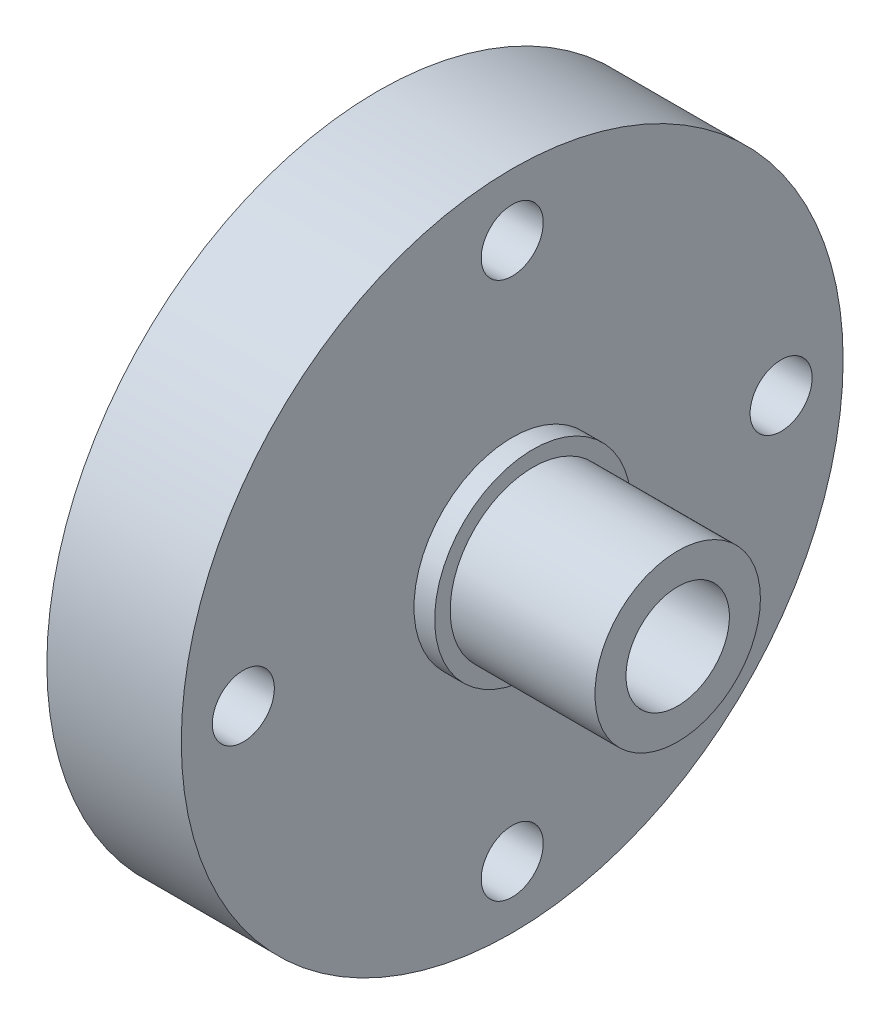
ISO-10303-21;
HEADER;
FILE_DESCRIPTION(('STEP AP214'),'2;1');
FILE_NAME('part.step','',(''),(''),'','','');
FILE_SCHEMA(('AUTOMOTIVE_DESIGN { 1 0 10303 214 1 1 1 1 }'));
ENDSEC;
DATA;
#1=APPLICATION_CONTEXT('core data for automotive mechanical design processes');
#2=APPLICATION_PROTOCOL_DEFINITION('international standard','automotive_design',2000,#1);
#3=PRODUCT_CONTEXT('',#1,'mechanical');
#4=PRODUCT('Part','Part','',(#3));
#5=PRODUCT_RELATED_PRODUCT_CATEGORY('part','',(#4));
#6=PRODUCT_DEFINITION_FORMATION('','',#4);
#7=PRODUCT_DEFINITION_CONTEXT('part definition',#1,'design');
#8=PRODUCT_DEFINITION('design','',#6,#7);
#9=PRODUCT_DEFINITION_SHAPE('','',#8);
#10=(LENGTH_UNIT() NAMED_UNIT(*) SI_UNIT(.MILLI.,.METRE.));
#11=(NAMED_UNIT(*) PLANE_ANGLE_UNIT() SI_UNIT($,.RADIAN.));
#12=(NAMED_UNIT(*) SI_UNIT($,.STERADIAN.) SOLID_ANGLE_UNIT());
#13=UNCERTAINTY_MEASURE_WITH_UNIT(LENGTH_MEASURE(1.E-05),#10,'distance_accuracy_value','');
#14=(GEOMETRIC_REPRESENTATION_CONTEXT(3) GLOBAL_UNCERTAINTY_ASSIGNED_CONTEXT((#13)) GLOBAL_UNIT_ASSIGNED_CONTEXT((#10,
#11,#12)) REPRESENTATION_CONTEXT('',''));
#15=CARTESIAN_POINT('',(0.,0.,0.));
#16=DIRECTION('',(0.,0.,1.));
#17=DIRECTION('',(1.,0.,0.));
#18=AXIS2_PLACEMENT_3D('',#15,#16,#17);
#19=CARTESIAN_POINT('',(6.5,0.,0.));
#20=DIRECTION('',(1.,0.,0.));
#21=DIRECTION('',(0.,0.,-1.));
#22=AXIS2_PLACEMENT_3D('',#19,#20,#21);
#23=PLANE('',#22);
#24=CARTESIAN_POINT('',(6.5,0.,0.));
#25=DIRECTION('',(1.,0.,0.));
#26=DIRECTION('',(0.,0.,-1.));
#27=AXIS2_PLACEMENT_3D('',#24,#25,#26);
#28=CIRCLE('',#27,16.);
#29=CARTESIAN_POINT('',(6.5,0.,16.));
#30=VERTEX_POINT('',#29);
#31=EDGE_CURVE('E51',#30,#30,#28,.T.);
#32=ORIENTED_EDGE('',*,*,#31,.T.);
#33=EDGE_LOOP('',(#32));
#34=FACE_BOUND('',#33,.T.);
#35=CARTESIAN_POINT('',(6.5,1.36167772214882E-13,13.));
#36=DIRECTION('',(1.,0.,0.));
#37=DIRECTION('',(0.,0.,-1.));
#38=AXIS2_PLACEMENT_3D('',#35,#36,#37);
#39=CIRCLE('',#38,1.5);
#40=CARTESIAN_POINT('',(6.5,1.36167772214882E-13,11.5));
#41=VERTEX_POINT('',#40);
#42=EDGE_CURVE('E86',#41,#41,#39,.T.);
#43=ORIENTED_EDGE('',*,*,#42,.F.);
#44=EDGE_LOOP('',(#43));
#45=FACE_BOUND('',#44,.T.);
#46=CARTESIAN_POINT('',(6.5,-13.,0.));
#47=DIRECTION('',(1.,0.,0.));
#48=DIRECTION('',(0.,0.,-1.));
#49=AXIS2_PLACEMENT_3D('',#46,#47,#48);
#50=CIRCLE('',#49,1.5);
#51=CARTESIAN_POINT('',(6.5,-13.,-1.49999999999991));
#52=VERTEX_POINT('',#51);
#53=EDGE_CURVE('E80',#52,#52,#50,.T.);
#54=ORIENTED_EDGE('',*,*,#53,.F.);
#55=EDGE_LOOP('',(#54));
#56=FACE_BOUND('',#55,.T.);
#57=CARTESIAN_POINT('',(6.5,0.,-13.));
#58=DIRECTION('',(1.,0.,0.));
#59=DIRECTION('',(0.,0.,-1.));
#60=AXIS2_PLACEMENT_3D('',#57,#58,#59);
#61=CIRCLE('',#60,1.5);
#62=CARTESIAN_POINT('',(6.5,0.,-14.5));
#63=VERTEX_POINT('',#62);
#64=EDGE_CURVE('E74',#63,#63,#61,.T.);
#65=ORIENTED_EDGE('',*,*,#64,.F.);
#66=EDGE_LOOP('',(#65));
#67=FACE_BOUND('',#66,.T.);
#68=CARTESIAN_POINT('',(6.5,13.,0.));
#69=DIRECTION('',(1.,0.,0.));
#70=DIRECTION('',(0.,0.,-1.));
#71=AXIS2_PLACEMENT_3D('',#68,#69,#70);
#72=CIRCLE('',#71,1.5);
#73=CARTESIAN_POINT('',(6.5,13.,-1.5));
#74=VERTEX_POINT('',#73);
#75=EDGE_CURVE('E71',#74,#74,#72,.T.);
#76=ORIENTED_EDGE('',*,*,#75,.F.);
#77=EDGE_LOOP('',(#76));
#78=FACE_BOUND('',#77,.T.);
#79=CARTESIAN_POINT('',(6.5,0.,0.));
#80=DIRECTION('',(1.,0.,0.));
#81=DIRECTION('',(0.,0.,-1.));
#82=AXIS2_PLACEMENT_3D('',#79,#80,#81);
#83=CIRCLE('',#82,4.75);
#84=CARTESIAN_POINT('',(6.5,0.,-4.75));
#85=VERTEX_POINT('',#84);
#86=EDGE_CURVE('E64',#85,#85,#83,.T.);
#87=ORIENTED_EDGE('',*,*,#86,.F.);
#88=EDGE_LOOP('',(#87));
#89=FACE_BOUND('',#88,.T.);
#90=ADVANCED_FACE('F43',(#34,#45,#56,#67,#78,#89),#23,.T.);
#91=CARTESIAN_POINT('',(0.,0.,0.));
#92=DIRECTION('',(1.,0.,0.));
#93=DIRECTION('',(0.,0.,-1.));
#94=AXIS2_PLACEMENT_3D('',#91,#92,#93);
#95=PLANE('',#94);
#96=CARTESIAN_POINT('',(0.,13.,0.));
#97=DIRECTION('',(1.,0.,0.));
#98=DIRECTION('',(0.,0.,-1.));
#99=AXIS2_PLACEMENT_3D('',#96,#97,#98);
#100=CIRCLE('',#99,1.5);
#101=CARTESIAN_POINT('',(0.,13.,-1.5));
#102=VERTEX_POINT('',#101);
#103=EDGE_CURVE('E67',#102,#102,#100,.T.);
#104=ORIENTED_EDGE('',*,*,#103,.T.);
#105=EDGE_LOOP('',(#104));
#106=FACE_BOUND('',#105,.T.);
#107=CARTESIAN_POINT('',(0.,0.,-13.));
#108=DIRECTION('',(1.,0.,0.));
#109=DIRECTION('',(0.,0.,-1.));
#110=AXIS2_PLACEMENT_3D('',#107,#108,#109);
#111=CIRCLE('',#110,1.5);
#112=CARTESIAN_POINT('',(0.,0.,-14.5));
#113=VERTEX_POINT('',#112);
#114=EDGE_CURVE('E77',#113,#113,#111,.T.);
#115=ORIENTED_EDGE('',*,*,#114,.T.);
#116=EDGE_LOOP('',(#115));
#117=FACE_BOUND('',#116,.T.);
#118=CARTESIAN_POINT('',(0.,-13.,0.));
#119=DIRECTION('',(1.,0.,0.));
#120=DIRECTION('',(0.,0.,-1.));
#121=AXIS2_PLACEMENT_3D('',#118,#119,#120);
#122=CIRCLE('',#121,1.5);
#123=CARTESIAN_POINT('',(0.,-13.,-1.49999999999991));
#124=VERTEX_POINT('',#123);
#125=EDGE_CURVE('E83',#124,#124,#122,.T.);
#126=ORIENTED_EDGE('',*,*,#125,.T.);
#127=EDGE_LOOP('',(#126));
#128=FACE_BOUND('',#127,.T.);
#129=CARTESIAN_POINT('',(0.,1.36167772214882E-13,13.));
#130=DIRECTION('',(1.,0.,0.));
#131=DIRECTION('',(0.,0.,-1.));
#132=AXIS2_PLACEMENT_3D('',#129,#130,#131);
#133=CIRCLE('',#132,1.5);
#134=CARTESIAN_POINT('',(0.,1.36167772214882E-13,11.5));
#135=VERTEX_POINT('',#134);
#136=EDGE_CURVE('E63',#135,#135,#133,.T.);
#137=ORIENTED_EDGE('',*,*,#136,.T.);
#138=EDGE_LOOP('',(#137));
#139=FACE_BOUND('',#138,.T.);
#140=CARTESIAN_POINT('',(0.,0.,0.));
#141=DIRECTION('',(1.,0.,0.));
#142=DIRECTION('',(0.,0.,-1.));
#143=AXIS2_PLACEMENT_3D('',#140,#141,#142);
#144=CIRCLE('',#143,16.);
#145=CARTESIAN_POINT('',(0.,0.,16.));
#146=VERTEX_POINT('',#145);
#147=EDGE_CURVE('E47',#146,#146,#144,.T.);
#148=ORIENTED_EDGE('',*,*,#147,.F.);
#149=EDGE_LOOP('',(#148));
#150=FACE_BOUND('',#149,.T.);
#151=CARTESIAN_POINT('',(0.,0.,0.));
#152=DIRECTION('',(1.,0.,0.));
#153=DIRECTION('',(0.,0.,-1.));
#154=AXIS2_PLACEMENT_3D('',#151,#152,#153);
#155=CIRCLE('',#154,2.5);
#156=CARTESIAN_POINT('',(0.,0.,2.5));
#157=VERTEX_POINT('',#156);
#158=EDGE_CURVE('E70',#157,#157,#155,.T.);
#159=ORIENTED_EDGE('',*,*,#158,.T.);
#160=EDGE_LOOP('',(#159));
#161=FACE_BOUND('',#160,.T.);
#162=ADVANCED_FACE('F98',(#106,#117,#128,#139,#150,#161),#95,.F.);
#163=CARTESIAN_POINT('',(6.5,0.,0.));
#164=DIRECTION('',(-1.,0.,0.));
#165=DIRECTION('',(0.,0.,1.));
#166=AXIS2_PLACEMENT_3D('',#163,#164,#165);
#167=CYLINDRICAL_SURFACE('',#166,16.);
#168=CARTESIAN_POINT('',(6.5,0.,16.));
#169=CARTESIAN_POINT('',(6.43229166666667,0.,16.));
#170=CARTESIAN_POINT('',(6.36458333333333,0.,16.));
#171=CARTESIAN_POINT('',(6.22916666666667,0.,16.));
#172=CARTESIAN_POINT('',(6.16145833333333,0.,16.));
#173=CARTESIAN_POINT('',(6.02604166666667,0.,16.));
#174=CARTESIAN_POINT('',(5.95833333333333,0.,16.));
#175=CARTESIAN_POINT('',(5.82291666666667,0.,16.));
#176=CARTESIAN_POINT('',(5.75520833333333,0.,16.));
#177=CARTESIAN_POINT('',(5.61979166666667,0.,16.));
#178=CARTESIAN_POINT('',(5.55208333333333,0.,16.));
#179=CARTESIAN_POINT('',(5.41666666666667,0.,16.));
#180=CARTESIAN_POINT('',(5.34895833333333,0.,16.));
#181=CARTESIAN_POINT('',(5.21354166666667,0.,16.));
#182=CARTESIAN_POINT('',(5.14583333333333,0.,16.));
#183=CARTESIAN_POINT('',(5.01041666666667,0.,16.));
#184=CARTESIAN_POINT('',(4.94270833333333,0.,16.));
#185=CARTESIAN_POINT('',(4.80729166666667,0.,16.));
#186=CARTESIAN_POINT('',(4.73958333333333,0.,16.));
#187=CARTESIAN_POINT('',(4.60416666666667,0.,16.));
#188=CARTESIAN_POINT('',(4.53645833333333,0.,16.));
#189=CARTESIAN_POINT('',(4.40104166666667,0.,16.));
#190=CARTESIAN_POINT('',(4.33333333333333,0.,16.));
#191=CARTESIAN_POINT('',(4.19791666666667,0.,16.));
#192=CARTESIAN_POINT('',(4.13020833333333,0.,16.));
#193=CARTESIAN_POINT('',(3.99479166666667,0.,16.));
#194=CARTESIAN_POINT('',(3.92708333333333,0.,16.));
#195=CARTESIAN_POINT('',(3.79166666666667,0.,16.));
#196=CARTESIAN_POINT('',(3.72395833333333,0.,16.));
#197=CARTESIAN_POINT('',(3.58854166666667,0.,16.));
#198=CARTESIAN_POINT('',(3.52083333333333,0.,16.));
#199=CARTESIAN_POINT('',(3.38541666666667,0.,16.));
#200=CARTESIAN_POINT('',(3.31770833333333,0.,16.));
#201=CARTESIAN_POINT('',(3.18229166666667,0.,16.));
#202=CARTESIAN_POINT('',(3.11458333333333,0.,16.));
#203=CARTESIAN_POINT('',(2.97916666666667,0.,16.));
#204=CARTESIAN_POINT('',(2.91145833333333,0.,16.));
#205=CARTESIAN_POINT('',(2.77604166666667,0.,16.));
#206=CARTESIAN_POINT('',(2.70833333333333,0.,16.));
#207=CARTESIAN_POINT('',(2.57291666666667,0.,16.));
#208=CARTESIAN_POINT('',(2.50520833333333,0.,16.));
#209=CARTESIAN_POINT('',(2.36979166666667,0.,16.));
#210=CARTESIAN_POINT('',(2.30208333333333,0.,16.));
#211=CARTESIAN_POINT('',(2.16666666666667,0.,16.));
#212=CARTESIAN_POINT('',(2.09895833333333,0.,16.));
#213=CARTESIAN_POINT('',(1.96354166666667,0.,16.));
#214=CARTESIAN_POINT('',(1.89583333333333,0.,16.));
#215=CARTESIAN_POINT('',(1.76041666666667,0.,16.));
#216=CARTESIAN_POINT('',(1.69270833333333,0.,16.));
#217=CARTESIAN_POINT('',(1.55729166666667,0.,16.));
#218=CARTESIAN_POINT('',(1.48958333333333,0.,16.));
#219=CARTESIAN_POINT('',(1.35416666666667,0.,16.));
#220=CARTESIAN_POINT('',(1.28645833333333,0.,16.));
#221=CARTESIAN_POINT('',(1.15104166666667,0.,16.));
#222=CARTESIAN_POINT('',(1.08333333333333,0.,16.));
#223=CARTESIAN_POINT('',(0.947916666666667,0.,16.));
#224=CARTESIAN_POINT('',(0.880208333333333,0.,16.));
#225=CARTESIAN_POINT('',(0.744791666666667,0.,16.));
#226=CARTESIAN_POINT('',(0.677083333333333,0.,16.));
#227=CARTESIAN_POINT('',(0.541666666666667,0.,16.));
#228=CARTESIAN_POINT('',(0.473958333333333,0.,16.));
#229=CARTESIAN_POINT('',(0.338541666666667,0.,16.));
#230=CARTESIAN_POINT('',(0.270833333333334,0.,16.));
#231=CARTESIAN_POINT('',(0.135416666666667,0.,16.));
#232=CARTESIAN_POINT('',(0.0677083333333334,0.,16.));
#233=CARTESIAN_POINT('',(0.,0.,16.));
#234=B_SPLINE_CURVE_WITH_KNOTS('',3,(#168,#169,#170,#171,#172,#173,#174,#175,#176,#177,#178,
#179,#180,#181,#182,#183,#184,#185,#186,#187,#188,#189,#190,#191,#192,#193,#194,#195,#196,#197,
#198,#199,#200,#201,#202,#203,#204,#205,#206,#207,#208,#209,#210,#211,#212,#213,#214,#215,#216,
#217,#218,#219,#220,#221,#222,#223,#224,#225,#226,#227,#228,#229,#230,#231,#232,#233),
.UNSPECIFIED.,.F.,.F.,(4,2,2,2,2,2,2,2,2,2,2,2,2,2,2,2,2,2,2,2,2,2,2,2,2,2,2,2,2,2,2,2,4),(0.,
0.203124999999999,0.40625,0.609375,0.812499999999999,1.015625,1.21875,1.421875,1.625,1.828125,
2.03125,2.234375,2.4375,2.640625,2.84375,3.046875,3.25,3.453125,3.65625,3.859375,4.0625,
4.265625,4.46875,4.671875,4.875,5.078125,5.28125,5.484375,5.6875,5.890625,6.09375,6.296875,6.5),.UNSPECIFIED.);
#235=EDGE_CURVE('BSEAM45',#30,#146,#234,.T.);
#236=ORIENTED_EDGE('',*,*,#31,.F.);
#237=ORIENTED_EDGE('',*,*,#147,.T.);
#238=ORIENTED_EDGE('',*,*,#235,.T.);
#239=ORIENTED_EDGE('',*,*,#235,.F.);
#240=EDGE_LOOP('',(#236,#238,#237,#239));
#241=FACE_BOUND('',#240,.T.);
#242=ADVANCED_FACE('F45',(#241),#167,.T.);
#243=CARTESIAN_POINT('',(6.5,0.,0.));
#244=DIRECTION('',(-1.,0.,0.));
#245=DIRECTION('',(0.,0.,1.));
#246=AXIS2_PLACEMENT_3D('',#243,#244,#245);
#247=CYLINDRICAL_SURFACE('',#246,2.5);
#248=CARTESIAN_POINT('',(14.5,0.,0.));
#249=DIRECTION('',(1.,0.,0.));
#250=DIRECTION('',(0.,0.,-1.));
#251=AXIS2_PLACEMENT_3D('',#248,#249,#250);
#252=CIRCLE('',#251,2.5);
#253=CARTESIAN_POINT('',(14.5,0.,2.5));
#254=VERTEX_POINT('',#253);
#255=EDGE_CURVE('E152',#254,#254,#252,.T.);
#256=CARTESIAN_POINT('',(0.,0.,2.5));
#257=CARTESIAN_POINT('',(0.151041666666667,0.,2.5));
#258=CARTESIAN_POINT('',(0.302083333333334,0.,2.5));
#259=CARTESIAN_POINT('',(0.604166666666667,0.,2.5));
#260=CARTESIAN_POINT('',(0.755208333333333,0.,2.5));
#261=CARTESIAN_POINT('',(1.05729166666667,0.,2.5));
#262=CARTESIAN_POINT('',(1.20833333333333,0.,2.5));
#263=CARTESIAN_POINT('',(1.51041666666667,0.,2.5));
#264=CARTESIAN_POINT('',(1.66145833333333,0.,2.5));
#265=CARTESIAN_POINT('',(1.96354166666667,0.,2.5));
#266=CARTESIAN_POINT('',(2.11458333333333,0.,2.5));
#267=CARTESIAN_POINT('',(2.41666666666667,0.,2.5));
#268=CARTESIAN_POINT('',(2.56770833333333,0.,2.5));
#269=CARTESIAN_POINT('',(2.86979166666667,0.,2.5));
#270=CARTESIAN_POINT('',(3.02083333333333,0.,2.5));
#271=CARTESIAN_POINT('',(3.32291666666667,0.,2.5));
#272=CARTESIAN_POINT('',(3.47395833333333,0.,2.5));
#273=CARTESIAN_POINT('',(3.77604166666667,0.,2.5));
#274=CARTESIAN_POINT('',(3.92708333333333,0.,2.5));
#275=CARTESIAN_POINT('',(4.22916666666667,0.,2.5));
#276=CARTESIAN_POINT('',(4.38020833333333,0.,2.5));
#277=CARTESIAN_POINT('',(4.68229166666667,0.,2.5));
#278=CARTESIAN_POINT('',(4.83333333333333,0.,2.5));
#279=CARTESIAN_POINT('',(5.13541666666667,0.,2.5));
#280=CARTESIAN_POINT('',(5.28645833333333,0.,2.5));
#281=CARTESIAN_POINT('',(5.58854166666667,0.,2.5));
#282=CARTESIAN_POINT('',(5.73958333333333,0.,2.5));
#283=CARTESIAN_POINT('',(6.04166666666667,0.,2.5));
#284=CARTESIAN_POINT('',(6.19270833333333,0.,2.5));
#285=CARTESIAN_POINT('',(6.49479166666667,0.,2.5));
#286=CARTESIAN_POINT('',(6.64583333333333,0.,2.5));
#287=CARTESIAN_POINT('',(6.94791666666667,0.,2.5));
#288=CARTESIAN_POINT('',(7.09895833333333,0.,2.5));
#289=CARTESIAN_POINT('',(7.40104166666667,0.,2.5));
#290=CARTESIAN_POINT('',(7.55208333333333,0.,2.5));
#291=CARTESIAN_POINT('',(7.85416666666667,0.,2.5));
#292=CARTESIAN_POINT('',(8.00520833333333,0.,2.5));
#293=CARTESIAN_POINT('',(8.30729166666667,0.,2.5));
#294=CARTESIAN_POINT('',(8.45833333333333,0.,2.5));
#295=CARTESIAN_POINT('',(8.76041666666667,0.,2.5));
#296=CARTESIAN_POINT('',(8.91145833333333,0.,2.5));
#297=CARTESIAN_POINT('',(9.21354166666666,0.,2.5));
#298=CARTESIAN_POINT('',(9.36458333333333,0.,2.5));
#299=CARTESIAN_POINT('',(9.66666666666667,0.,2.5));
#300=CARTESIAN_POINT('',(9.81770833333333,0.,2.5));
#301=CARTESIAN_POINT('',(10.1197916666667,0.,2.5));
#302=CARTESIAN_POINT('',(10.2708333333333,0.,2.5));
#303=CARTESIAN_POINT('',(10.5729166666667,0.,2.5));
#304=CARTESIAN_POINT('',(10.7239583333333,0.,2.5));
#305=CARTESIAN_POINT('',(11.0260416666667,0.,2.5));
#306=CARTESIAN_POINT('',(11.1770833333333,0.,2.5));
#307=CARTESIAN_POINT('',(11.4791666666667,0.,2.5));
#308=CARTESIAN_POINT('',(11.6302083333333,0.,2.5));
#309=CARTESIAN_POINT('',(11.9322916666667,0.,2.5));
#310=CARTESIAN_POINT('',(12.0833333333333,0.,2.5));
#311=CARTESIAN_POINT('',(12.3854166666667,0.,2.5));
#312=CARTESIAN_POINT('',(12.5364583333333,0.,2.5));
#313=CARTESIAN_POINT('',(12.8385416666667,0.,2.5));
#314=CARTESIAN_POINT('',(12.9895833333333,0.,2.5));
#315=CARTESIAN_POINT('',(13.2916666666667,0.,2.5));
#316=CARTESIAN_POINT('',(13.4427083333333,0.,2.5));
#317=CARTESIAN_POINT('',(13.7447916666667,0.,2.5));
#318=CARTESIAN_POINT('',(13.8958333333333,0.,2.5));
#319=CARTESIAN_POINT('',(14.1979166666667,0.,2.5));
#320=CARTESIAN_POINT('',(14.3489583333333,0.,2.5));
#321=CARTESIAN_POINT('',(14.5,0.,2.5));
#322=B_SPLINE_CURVE_WITH_KNOTS('',3,(#256,#257,#258,#259,#260,#261,#262,#263,#264,#265,#266,
#267,#268,#269,#270,#271,#272,#273,#274,#275,#276,#277,#278,#279,#280,#281,#282,#283,#284,#285,
#286,#287,#288,#289,#290,#291,#292,#293,#294,#295,#296,#297,#298,#299,#300,#301,#302,#303,#304,
#305,#306,#307,#308,#309,#310,#311,#312,#313,#314,#315,#316,#317,#318,#319,#320,#321),
.UNSPECIFIED.,.F.,.F.,(4,2,2,2,2,2,2,2,2,2,2,2,2,2,2,2,2,2,2,2,2,2,2,2,2,2,2,2,2,2,2,2,4),(0.,
0.453125,0.90625,1.359375,1.8125,2.265625,2.71875,3.171875,3.625,4.078125,4.53125,4.984375,
5.4375,5.890625,6.34375,6.796875,7.25,7.703125,8.15625,8.609375,9.0625,9.515625,9.96875,
10.421875,10.875,11.328125,11.78125,12.234375,12.6875,13.140625,13.59375,14.046875,14.5),.UNSPECIFIED.);
#323=EDGE_CURVE('BSEAM105',#157,#254,#322,.T.);
#324=ORIENTED_EDGE('',*,*,#158,.F.);
#325=ORIENTED_EDGE('',*,*,#255,.T.);
#326=ORIENTED_EDGE('',*,*,#323,.T.);
#327=ORIENTED_EDGE('',*,*,#323,.F.);
#328=EDGE_LOOP('',(#324,#326,#325,#327));
#329=FACE_BOUND('',#328,.T.);
#330=ADVANCED_FACE('F105',(#329),#247,.F.);
#331=CARTESIAN_POINT('',(0.,1.36167772214882E-13,13.));
#332=DIRECTION('',(1.,0.,0.));
#333=DIRECTION('',(0.,0.,-1.));
#334=AXIS2_PLACEMENT_3D('',#331,#332,#333);
#335=CYLINDRICAL_SURFACE('',#334,1.5);
#336=CARTESIAN_POINT('',(0.,1.36167772214882E-13,11.5));
#337=CARTESIAN_POINT('',(0.0677083333333332,1.36167772214882E-13,11.5));
#338=CARTESIAN_POINT('',(0.135416666666667,1.36167772214882E-13,11.5));
#339=CARTESIAN_POINT('',(0.270833333333333,1.36167772214882E-13,11.5));
#340=CARTESIAN_POINT('',(0.338541666666667,1.36167772214882E-13,11.5));
#341=CARTESIAN_POINT('',(0.473958333333333,1.36167772214882E-13,11.5));
#342=CARTESIAN_POINT('',(0.541666666666667,1.36167772214882E-13,11.5));
#343=CARTESIAN_POINT('',(0.677083333333333,1.36167772214882E-13,11.5));
#344=CARTESIAN_POINT('',(0.744791666666667,1.36167772214882E-13,11.5));
#345=CARTESIAN_POINT('',(0.880208333333333,1.36167772214882E-13,11.5));
#346=CARTESIAN_POINT('',(0.947916666666667,1.36167772214882E-13,11.5));
#347=CARTESIAN_POINT('',(1.08333333333333,1.36167772214882E-13,11.5));
#348=CARTESIAN_POINT('',(1.15104166666667,1.36167772214882E-13,11.5));
#349=CARTESIAN_POINT('',(1.28645833333333,1.36167772214882E-13,11.5));
#350=CARTESIAN_POINT('',(1.35416666666667,1.36167772214882E-13,11.5));
#351=CARTESIAN_POINT('',(1.48958333333333,1.36167772214882E-13,11.5));
#352=CARTESIAN_POINT('',(1.55729166666667,1.36167772214882E-13,11.5));
#353=CARTESIAN_POINT('',(1.69270833333333,1.36167772214882E-13,11.5));
#354=CARTESIAN_POINT('',(1.76041666666667,1.36167772214882E-13,11.5));
#355=CARTESIAN_POINT('',(1.89583333333333,1.36167772214882E-13,11.5));
#356=CARTESIAN_POINT('',(1.96354166666667,1.36167772214882E-13,11.5));
#357=CARTESIAN_POINT('',(2.09895833333333,1.36167772214882E-13,11.5));
#358=CARTESIAN_POINT('',(2.16666666666667,1.36167772214882E-13,11.5));
#359=CARTESIAN_POINT('',(2.30208333333333,1.36167772214882E-13,11.5));
#360=CARTESIAN_POINT('',(2.36979166666667,1.36167772214882E-13,11.5));
#361=CARTESIAN_POINT('',(2.50520833333333,1.36167772214882E-13,11.5));
#362=CARTESIAN_POINT('',(2.57291666666667,1.36167772214882E-13,11.5));
#363=CARTESIAN_POINT('',(2.70833333333333,1.36167772214882E-13,11.5));
#364=CARTESIAN_POINT('',(2.77604166666667,1.36167772214882E-13,11.5));
#365=CARTESIAN_POINT('',(2.91145833333333,1.36167772214882E-13,11.5));
#366=CARTESIAN_POINT('',(2.97916666666667,1.36167772214882E-13,11.5));
#367=CARTESIAN_POINT('',(3.11458333333333,1.36167772214882E-13,11.5));
#368=CARTESIAN_POINT('',(3.18229166666667,1.36167772214882E-13,11.5));
#369=CARTESIAN_POINT('',(3.31770833333333,1.36167772214882E-13,11.5));
#370=CARTESIAN_POINT('',(3.38541666666667,1.36167772214882E-13,11.5));
#371=CARTESIAN_POINT('',(3.52083333333333,1.36167772214882E-13,11.5));
#372=CARTESIAN_POINT('',(3.58854166666667,1.36167772214882E-13,11.5));
#373=CARTESIAN_POINT('',(3.72395833333333,1.36167772214882E-13,11.5));
#374=CARTESIAN_POINT('',(3.79166666666667,1.36167772214882E-13,11.5));
#375=CARTESIAN_POINT('',(3.92708333333333,1.36167772214882E-13,11.5));
#376=CARTESIAN_POINT('',(3.99479166666667,1.36167772214882E-13,11.5));
#377=CARTESIAN_POINT('',(4.13020833333333,1.36167772214882E-13,11.5));
#378=CARTESIAN_POINT('',(4.19791666666667,1.36167772214882E-13,11.5));
#379=CARTESIAN_POINT('',(4.33333333333333,1.36167772214882E-13,11.5));
#380=CARTESIAN_POINT('',(4.40104166666667,1.36167772214882E-13,11.5));
#381=CARTESIAN_POINT('',(4.53645833333333,1.36167772214882E-13,11.5));
#382=CARTESIAN_POINT('',(4.60416666666667,1.36167772214882E-13,11.5));
#383=CARTESIAN_POINT('',(4.73958333333333,1.36167772214882E-13,11.5));
#384=CARTESIAN_POINT('',(4.80729166666667,1.36167772214882E-13,11.5));
#385=CARTESIAN_POINT('',(4.94270833333333,1.36167772214882E-13,11.5));
#386=CARTESIAN_POINT('',(5.01041666666667,1.36167772214882E-13,11.5));
#387=CARTESIAN_POINT('',(5.14583333333333,1.36167772214882E-13,11.5));
#388=CARTESIAN_POINT('',(5.21354166666667,1.36167772214882E-13,11.5));
#389=CARTESIAN_POINT('',(5.34895833333333,1.36167772214882E-13,11.5));
#390=CARTESIAN_POINT('',(5.41666666666667,1.36167772214882E-13,11.5));
#391=CARTESIAN_POINT('',(5.55208333333333,1.36167772214882E-13,11.5));
#392=CARTESIAN_POINT('',(5.61979166666667,1.36167772214882E-13,11.5));
#393=CARTESIAN_POINT('',(5.75520833333333,1.36167772214882E-13,11.5));
#394=CARTESIAN_POINT('',(5.82291666666667,1.36167772214882E-13,11.5));
#395=CARTESIAN_POINT('',(5.95833333333333,1.36167772214882E-13,11.5));
#396=CARTESIAN_POINT('',(6.02604166666667,1.36167772214882E-13,11.5));
#397=CARTESIAN_POINT('',(6.16145833333333,1.36167772214882E-13,11.5));
#398=CARTESIAN_POINT('',(6.22916666666667,1.36167772214882E-13,11.5));
#399=CARTESIAN_POINT('',(6.36458333333333,1.36167772214882E-13,11.5));
#400=CARTESIAN_POINT('',(6.43229166666667,1.36167772214882E-13,11.5));
#401=CARTESIAN_POINT('',(6.5,1.36167772214882E-13,11.5));
#402=B_SPLINE_CURVE_WITH_KNOTS('',3,(#336,#337,#338,#339,#340,#341,#342,#343,#344,#345,#346,
#347,#348,#349,#350,#351,#352,#353,#354,#355,#356,#357,#358,#359,#360,#361,#362,#363,#364,#365,
#366,#367,#368,#369,#370,#371,#372,#373,#374,#375,#376,#377,#378,#379,#380,#381,#382,#383,#384,
#385,#386,#387,#388,#389,#390,#391,#392,#393,#394,#395,#396,#397,#398,#399,#400,#401),
.UNSPECIFIED.,.F.,.F.,(4,2,2,2,2,2,2,2,2,2,2,2,2,2,2,2,2,2,2,2,2,2,2,2,2,2,2,2,2,2,2,2,4),(0.,
0.203125,0.40625,0.609375,0.8125,1.015625,1.21875,1.421875,1.625,1.828125,2.03125,2.234375,
2.4375,2.640625,2.84375,3.046875,3.25,3.453125,3.65625,3.859375,4.0625,4.265625,4.46875,
4.671875,4.875,5.078125,5.28125,5.484375,5.6875,5.890625,6.09375,6.296875,6.5),.UNSPECIFIED.);
#403=EDGE_CURVE('BSEAM114',#135,#41,#402,.T.);
#404=ORIENTED_EDGE('',*,*,#136,.F.);
#405=ORIENTED_EDGE('',*,*,#42,.T.);
#406=ORIENTED_EDGE('',*,*,#403,.T.);
#407=ORIENTED_EDGE('',*,*,#403,.F.);
#408=EDGE_LOOP('',(#404,#406,#405,#407));
#409=FACE_BOUND('',#408,.T.);
#410=ADVANCED_FACE('F114',(#409),#335,.F.);
#411=CARTESIAN_POINT('',(0.,-13.,0.));
#412=DIRECTION('',(1.,0.,0.));
#413=DIRECTION('',(0.,0.,-1.));
#414=AXIS2_PLACEMENT_3D('',#411,#412,#413);
#415=CYLINDRICAL_SURFACE('',#414,1.5);
#416=CARTESIAN_POINT('',(0.,-13.,-1.49999999999991));
#417=CARTESIAN_POINT('',(0.0677083333333332,-13.,-1.49999999999991));
#418=CARTESIAN_POINT('',(0.135416666666667,-13.,-1.49999999999991));
#419=CARTESIAN_POINT('',(0.270833333333333,-13.,-1.49999999999991));
#420=CARTESIAN_POINT('',(0.338541666666667,-13.,-1.49999999999991));
#421=CARTESIAN_POINT('',(0.473958333333333,-13.,-1.49999999999991));
#422=CARTESIAN_POINT('',(0.541666666666667,-13.,-1.49999999999991));
#423=CARTESIAN_POINT('',(0.677083333333333,-13.,-1.49999999999991));
#424=CARTESIAN_POINT('',(0.744791666666667,-13.,-1.49999999999991));
#425=CARTESIAN_POINT('',(0.880208333333333,-13.,-1.49999999999991));
#426=CARTESIAN_POINT('',(0.947916666666667,-13.,-1.49999999999991));
#427=CARTESIAN_POINT('',(1.08333333333333,-13.,-1.49999999999991));
#428=CARTESIAN_POINT('',(1.15104166666667,-13.,-1.49999999999991));
#429=CARTESIAN_POINT('',(1.28645833333333,-13.,-1.49999999999991));
#430=CARTESIAN_POINT('',(1.35416666666667,-13.,-1.49999999999991));
#431=CARTESIAN_POINT('',(1.48958333333333,-13.,-1.49999999999991));
#432=CARTESIAN_POINT('',(1.55729166666667,-13.,-1.49999999999991));
#433=CARTESIAN_POINT('',(1.69270833333333,-13.,-1.49999999999991));
#434=CARTESIAN_POINT('',(1.76041666666667,-13.,-1.49999999999991));
#435=CARTESIAN_POINT('',(1.89583333333333,-13.,-1.49999999999991));
#436=CARTESIAN_POINT('',(1.96354166666667,-13.,-1.49999999999991));
#437=CARTESIAN_POINT('',(2.09895833333333,-13.,-1.49999999999991));
#438=CARTESIAN_POINT('',(2.16666666666667,-13.,-1.49999999999991));
#439=CARTESIAN_POINT('',(2.30208333333333,-13.,-1.49999999999991));
#440=CARTESIAN_POINT('',(2.36979166666667,-13.,-1.49999999999991));
#441=CARTESIAN_POINT('',(2.50520833333333,-13.,-1.49999999999991));
#442=CARTESIAN_POINT('',(2.57291666666667,-13.,-1.49999999999991));
#443=CARTESIAN_POINT('',(2.70833333333333,-13.,-1.49999999999991));
#444=CARTESIAN_POINT('',(2.77604166666667,-13.,-1.49999999999991));
#445=CARTESIAN_POINT('',(2.91145833333333,-13.,-1.49999999999991));
#446=CARTESIAN_POINT('',(2.97916666666667,-13.,-1.49999999999991));
#447=CARTESIAN_POINT('',(3.11458333333333,-13.,-1.49999999999991));
#448=CARTESIAN_POINT('',(3.18229166666667,-13.,-1.49999999999991));
#449=CARTESIAN_POINT('',(3.31770833333333,-13.,-1.49999999999991));
#450=CARTESIAN_POINT('',(3.38541666666667,-13.,-1.49999999999991));
#451=CARTESIAN_POINT('',(3.52083333333333,-13.,-1.49999999999991));
#452=CARTESIAN_POINT('',(3.58854166666667,-13.,-1.49999999999991));
#453=CARTESIAN_POINT('',(3.72395833333333,-13.,-1.49999999999991));
#454=CARTESIAN_POINT('',(3.79166666666667,-13.,-1.49999999999991));
#455=CARTESIAN_POINT('',(3.92708333333333,-13.,-1.49999999999991));
#456=CARTESIAN_POINT('',(3.99479166666667,-13.,-1.49999999999991));
#457=CARTESIAN_POINT('',(4.13020833333333,-13.,-1.49999999999991));
#458=CARTESIAN_POINT('',(4.19791666666667,-13.,-1.49999999999991));
#459=CARTESIAN_POINT('',(4.33333333333333,-13.,-1.49999999999991));
#460=CARTESIAN_POINT('',(4.40104166666667,-13.,-1.49999999999991));
#461=CARTESIAN_POINT('',(4.53645833333333,-13.,-1.49999999999991));
#462=CARTESIAN_POINT('',(4.60416666666667,-13.,-1.49999999999991));
#463=CARTESIAN_POINT('',(4.73958333333333,-13.,-1.49999999999991));
#464=CARTESIAN_POINT('',(4.80729166666667,-13.,-1.49999999999991));
#465=CARTESIAN_POINT('',(4.94270833333333,-13.,-1.49999999999991));
#466=CARTESIAN_POINT('',(5.01041666666667,-13.,-1.49999999999991));
#467=CARTESIAN_POINT('',(5.14583333333333,-13.,-1.49999999999991));
#468=CARTESIAN_POINT('',(5.21354166666667,-13.,-1.49999999999991));
#469=CARTESIAN_POINT('',(5.34895833333333,-13.,-1.49999999999991));
#470=CARTESIAN_POINT('',(5.41666666666667,-13.,-1.49999999999991));
#471=CARTESIAN_POINT('',(5.55208333333333,-13.,-1.49999999999991));
#472=CARTESIAN_POINT('',(5.61979166666667,-13.,-1.49999999999991));
#473=CARTESIAN_POINT('',(5.75520833333333,-13.,-1.49999999999991));
#474=CARTESIAN_POINT('',(5.82291666666667,-13.,-1.49999999999991));
#475=CARTESIAN_POINT('',(5.95833333333333,-13.,-1.49999999999991));
#476=CARTESIAN_POINT('',(6.02604166666667,-13.,-1.49999999999991));
#477=CARTESIAN_POINT('',(6.16145833333333,-13.,-1.49999999999991));
#478=CARTESIAN_POINT('',(6.22916666666667,-13.,-1.49999999999991));
#479=CARTESIAN_POINT('',(6.36458333333333,-13.,-1.49999999999991));
#480=CARTESIAN_POINT('',(6.43229166666667,-13.,-1.49999999999991));
#481=CARTESIAN_POINT('',(6.5,-13.,-1.49999999999991));
#482=B_SPLINE_CURVE_WITH_KNOTS('',3,(#416,#417,#418,#419,#420,#421,#422,#423,#424,#425,#426,
#427,#428,#429,#430,#431,#432,#433,#434,#435,#436,#437,#438,#439,#440,#441,#442,#443,#444,#445,
#446,#447,#448,#449,#450,#451,#452,#453,#454,#455,#456,#457,#458,#459,#460,#461,#462,#463,#464,
#465,#466,#467,#468,#469,#470,#471,#472,#473,#474,#475,#476,#477,#478,#479,#480,#481),
.UNSPECIFIED.,.F.,.F.,(4,2,2,2,2,2,2,2,2,2,2,2,2,2,2,2,2,2,2,2,2,2,2,2,2,2,2,2,2,2,2,2,4),(0.,
0.203125,0.40625,0.609375,0.8125,1.015625,1.21875,1.421875,1.625,1.828125,2.03125,2.234375,
2.4375,2.640625,2.84375,3.046875,3.25,3.453125,3.65625,3.859375,4.0625,4.265625,4.46875,
4.671875,4.875,5.078125,5.28125,5.484375,5.6875,5.890625,6.09375,6.296875,6.5),.UNSPECIFIED.);
#483=EDGE_CURVE('BSEAM117',#124,#52,#482,.T.);
#484=ORIENTED_EDGE('',*,*,#125,.F.);
#485=ORIENTED_EDGE('',*,*,#53,.T.);
#486=ORIENTED_EDGE('',*,*,#483,.T.);
#487=ORIENTED_EDGE('',*,*,#483,.F.);
#488=EDGE_LOOP('',(#484,#486,#485,#487));
#489=FACE_BOUND('',#488,.T.);
#490=ADVANCED_FACE('F117',(#489),#415,.F.);
#491=CARTESIAN_POINT('',(0.,0.,-13.));
#492=DIRECTION('',(1.,0.,0.));
#493=DIRECTION('',(0.,0.,-1.));
#494=AXIS2_PLACEMENT_3D('',#491,#492,#493);
#495=CYLINDRICAL_SURFACE('',#494,1.5);
#496=CARTESIAN_POINT('',(0.,0.,-14.5));
#497=CARTESIAN_POINT('',(0.0677083333333332,0.,-14.5));
#498=CARTESIAN_POINT('',(0.135416666666667,0.,-14.5));
#499=CARTESIAN_POINT('',(0.270833333333333,0.,-14.5));
#500=CARTESIAN_POINT('',(0.338541666666667,0.,-14.5));
#501=CARTESIAN_POINT('',(0.473958333333333,0.,-14.5));
#502=CARTESIAN_POINT('',(0.541666666666667,0.,-14.5));
#503=CARTESIAN_POINT('',(0.677083333333333,0.,-14.5));
#504=CARTESIAN_POINT('',(0.744791666666667,0.,-14.5));
#505=CARTESIAN_POINT('',(0.880208333333333,0.,-14.5));
#506=CARTESIAN_POINT('',(0.947916666666667,0.,-14.5));
#507=CARTESIAN_POINT('',(1.08333333333333,0.,-14.5));
#508=CARTESIAN_POINT('',(1.15104166666667,0.,-14.5));
#509=CARTESIAN_POINT('',(1.28645833333333,0.,-14.5));
#510=CARTESIAN_POINT('',(1.35416666666667,0.,-14.5));
#511=CARTESIAN_POINT('',(1.48958333333333,0.,-14.5));
#512=CARTESIAN_POINT('',(1.55729166666667,0.,-14.5));
#513=CARTESIAN_POINT('',(1.69270833333333,0.,-14.5));
#514=CARTESIAN_POINT('',(1.76041666666667,0.,-14.5));
#515=CARTESIAN_POINT('',(1.89583333333333,0.,-14.5));
#516=CARTESIAN_POINT('',(1.96354166666667,0.,-14.5));
#517=CARTESIAN_POINT('',(2.09895833333333,0.,-14.5));
#518=CARTESIAN_POINT('',(2.16666666666667,0.,-14.5));
#519=CARTESIAN_POINT('',(2.30208333333333,0.,-14.5));
#520=CARTESIAN_POINT('',(2.36979166666667,0.,-14.5));
#521=CARTESIAN_POINT('',(2.50520833333333,0.,-14.5));
#522=CARTESIAN_POINT('',(2.57291666666667,0.,-14.5));
#523=CARTESIAN_POINT('',(2.70833333333333,0.,-14.5));
#524=CARTESIAN_POINT('',(2.77604166666667,0.,-14.5));
#525=CARTESIAN_POINT('',(2.91145833333333,0.,-14.5));
#526=CARTESIAN_POINT('',(2.97916666666667,0.,-14.5));
#527=CARTESIAN_POINT('',(3.11458333333333,0.,-14.5));
#528=CARTESIAN_POINT('',(3.18229166666667,0.,-14.5));
#529=CARTESIAN_POINT('',(3.31770833333333,0.,-14.5));
#530=CARTESIAN_POINT('',(3.38541666666667,0.,-14.5));
#531=CARTESIAN_POINT('',(3.52083333333333,0.,-14.5));
#532=CARTESIAN_POINT('',(3.58854166666667,0.,-14.5));
#533=CARTESIAN_POINT('',(3.72395833333333,0.,-14.5));
#534=CARTESIAN_POINT('',(3.79166666666667,0.,-14.5));
#535=CARTESIAN_POINT('',(3.92708333333333,0.,-14.5));
#536=CARTESIAN_POINT('',(3.99479166666667,0.,-14.5));
#537=CARTESIAN_POINT('',(4.13020833333333,0.,-14.5));
#538=CARTESIAN_POINT('',(4.19791666666667,0.,-14.5));
#539=CARTESIAN_POINT('',(4.33333333333333,0.,-14.5));
#540=CARTESIAN_POINT('',(4.40104166666667,0.,-14.5));
#541=CARTESIAN_POINT('',(4.53645833333333,0.,-14.5));
#542=CARTESIAN_POINT('',(4.60416666666667,0.,-14.5));
#543=CARTESIAN_POINT('',(4.73958333333333,0.,-14.5));
#544=CARTESIAN_POINT('',(4.80729166666667,0.,-14.5));
#545=CARTESIAN_POINT('',(4.94270833333333,0.,-14.5));
#546=CARTESIAN_POINT('',(5.01041666666667,0.,-14.5));
#547=CARTESIAN_POINT('',(5.14583333333333,0.,-14.5));
#548=CARTESIAN_POINT('',(5.21354166666667,0.,-14.5));
#549=CARTESIAN_POINT('',(5.34895833333333,0.,-14.5));
#550=CARTESIAN_POINT('',(5.41666666666667,0.,-14.5));
#551=CARTESIAN_POINT('',(5.55208333333333,0.,-14.5));
#552=CARTESIAN_POINT('',(5.61979166666667,0.,-14.5));
#553=CARTESIAN_POINT('',(5.75520833333333,0.,-14.5));
#554=CARTESIAN_POINT('',(5.82291666666667,0.,-14.5));
#555=CARTESIAN_POINT('',(5.95833333333333,0.,-14.5));
#556=CARTESIAN_POINT('',(6.02604166666667,0.,-14.5));
#557=CARTESIAN_POINT('',(6.16145833333333,0.,-14.5));
#558=CARTESIAN_POINT('',(6.22916666666667,0.,-14.5));
#559=CARTESIAN_POINT('',(6.36458333333333,0.,-14.5));
#560=CARTESIAN_POINT('',(6.43229166666667,0.,-14.5));
#561=CARTESIAN_POINT('',(6.5,0.,-14.5));
#562=B_SPLINE_CURVE_WITH_KNOTS('',3,(#496,#497,#498,#499,#500,#501,#502,#503,#504,#505,#506,
#507,#508,#509,#510,#511,#512,#513,#514,#515,#516,#517,#518,#519,#520,#521,#522,#523,#524,#525,
#526,#527,#528,#529,#530,#531,#532,#533,#534,#535,#536,#537,#538,#539,#540,#541,#542,#543,#544,
#545,#546,#547,#548,#549,#550,#551,#552,#553,#554,#555,#556,#557,#558,#559,#560,#561),
.UNSPECIFIED.,.F.,.F.,(4,2,2,2,2,2,2,2,2,2,2,2,2,2,2,2,2,2,2,2,2,2,2,2,2,2,2,2,2,2,2,2,4),(0.,
0.203125,0.40625,0.609375,0.8125,1.015625,1.21875,1.421875,1.625,1.828125,2.03125,2.234375,
2.4375,2.640625,2.84375,3.046875,3.25,3.453125,3.65625,3.859375,4.0625,4.265625,4.46875,
4.671875,4.875,5.078125,5.28125,5.484375,5.6875,5.890625,6.09375,6.296875,6.5),.UNSPECIFIED.);
#563=EDGE_CURVE('BSEAM121',#113,#63,#562,.T.);
#564=ORIENTED_EDGE('',*,*,#114,.F.);
#565=ORIENTED_EDGE('',*,*,#64,.T.);
#566=ORIENTED_EDGE('',*,*,#563,.T.);
#567=ORIENTED_EDGE('',*,*,#563,.F.);
#568=EDGE_LOOP('',(#564,#566,#565,#567));
#569=FACE_BOUND('',#568,.T.);
#570=ADVANCED_FACE('F121',(#569),#495,.F.);
#571=CARTESIAN_POINT('',(0.,13.,0.));
#572=DIRECTION('',(1.,0.,0.));
#573=DIRECTION('',(0.,0.,-1.));
#574=AXIS2_PLACEMENT_3D('',#571,#572,#573);
#575=CYLINDRICAL_SURFACE('',#574,1.5);
#576=CARTESIAN_POINT('',(0.,13.,-1.5));
#577=CARTESIAN_POINT('',(0.0677083333333332,13.,-1.5));
#578=CARTESIAN_POINT('',(0.135416666666667,13.,-1.5));
#579=CARTESIAN_POINT('',(0.270833333333333,13.,-1.5));
#580=CARTESIAN_POINT('',(0.338541666666667,13.,-1.5));
#581=CARTESIAN_POINT('',(0.473958333333333,13.,-1.5));
#582=CARTESIAN_POINT('',(0.541666666666667,13.,-1.5));
#583=CARTESIAN_POINT('',(0.677083333333333,13.,-1.5));
#584=CARTESIAN_POINT('',(0.744791666666667,13.,-1.5));
#585=CARTESIAN_POINT('',(0.880208333333333,13.,-1.5));
#586=CARTESIAN_POINT('',(0.947916666666667,13.,-1.5));
#587=CARTESIAN_POINT('',(1.08333333333333,13.,-1.5));
#588=CARTESIAN_POINT('',(1.15104166666667,13.,-1.5));
#589=CARTESIAN_POINT('',(1.28645833333333,13.,-1.5));
#590=CARTESIAN_POINT('',(1.35416666666667,13.,-1.5));
#591=CARTESIAN_POINT('',(1.48958333333333,13.,-1.5));
#592=CARTESIAN_POINT('',(1.55729166666667,13.,-1.5));
#593=CARTESIAN_POINT('',(1.69270833333333,13.,-1.5));
#594=CARTESIAN_POINT('',(1.76041666666667,13.,-1.5));
#595=CARTESIAN_POINT('',(1.89583333333333,13.,-1.5));
#596=CARTESIAN_POINT('',(1.96354166666667,13.,-1.5));
#597=CARTESIAN_POINT('',(2.09895833333333,13.,-1.5));
#598=CARTESIAN_POINT('',(2.16666666666667,13.,-1.5));
#599=CARTESIAN_POINT('',(2.30208333333333,13.,-1.5));
#600=CARTESIAN_POINT('',(2.36979166666667,13.,-1.5));
#601=CARTESIAN_POINT('',(2.50520833333333,13.,-1.5));
#602=CARTESIAN_POINT('',(2.57291666666667,13.,-1.5));
#603=CARTESIAN_POINT('',(2.70833333333333,13.,-1.5));
#604=CARTESIAN_POINT('',(2.77604166666667,13.,-1.5));
#605=CARTESIAN_POINT('',(2.91145833333333,13.,-1.5));
#606=CARTESIAN_POINT('',(2.97916666666667,13.,-1.5));
#607=CARTESIAN_POINT('',(3.11458333333333,13.,-1.5));
#608=CARTESIAN_POINT('',(3.18229166666667,13.,-1.5));
#609=CARTESIAN_POINT('',(3.31770833333333,13.,-1.5));
#610=CARTESIAN_POINT('',(3.38541666666667,13.,-1.5));
#611=CARTESIAN_POINT('',(3.52083333333333,13.,-1.5));
#612=CARTESIAN_POINT('',(3.58854166666667,13.,-1.5));
#613=CARTESIAN_POINT('',(3.72395833333333,13.,-1.5));
#614=CARTESIAN_POINT('',(3.79166666666667,13.,-1.5));
#615=CARTESIAN_POINT('',(3.92708333333333,13.,-1.5));
#616=CARTESIAN_POINT('',(3.99479166666667,13.,-1.5));
#617=CARTESIAN_POINT('',(4.13020833333333,13.,-1.5));
#618=CARTESIAN_POINT('',(4.19791666666667,13.,-1.5));
#619=CARTESIAN_POINT('',(4.33333333333333,13.,-1.5));
#620=CARTESIAN_POINT('',(4.40104166666667,13.,-1.5));
#621=CARTESIAN_POINT('',(4.53645833333333,13.,-1.5));
#622=CARTESIAN_POINT('',(4.60416666666667,13.,-1.5));
#623=CARTESIAN_POINT('',(4.73958333333333,13.,-1.5));
#624=CARTESIAN_POINT('',(4.80729166666667,13.,-1.5));
#625=CARTESIAN_POINT('',(4.94270833333333,13.,-1.5));
#626=CARTESIAN_POINT('',(5.01041666666667,13.,-1.5));
#627=CARTESIAN_POINT('',(5.14583333333333,13.,-1.5));
#628=CARTESIAN_POINT('',(5.21354166666667,13.,-1.5));
#629=CARTESIAN_POINT('',(5.34895833333333,13.,-1.5));
#630=CARTESIAN_POINT('',(5.41666666666667,13.,-1.5));
#631=CARTESIAN_POINT('',(5.55208333333333,13.,-1.5));
#632=CARTESIAN_POINT('',(5.61979166666667,13.,-1.5));
#633=CARTESIAN_POINT('',(5.75520833333333,13.,-1.5));
#634=CARTESIAN_POINT('',(5.82291666666667,13.,-1.5));
#635=CARTESIAN_POINT('',(5.95833333333333,13.,-1.5));
#636=CARTESIAN_POINT('',(6.02604166666667,13.,-1.5));
#637=CARTESIAN_POINT('',(6.16145833333333,13.,-1.5));
#638=CARTESIAN_POINT('',(6.22916666666667,13.,-1.5));
#639=CARTESIAN_POINT('',(6.36458333333333,13.,-1.5));
#640=CARTESIAN_POINT('',(6.43229166666667,13.,-1.5));
#641=CARTESIAN_POINT('',(6.5,13.,-1.5));
#642=B_SPLINE_CURVE_WITH_KNOTS('',3,(#576,#577,#578,#579,#580,#581,#582,#583,#584,#585,#586,
#587,#588,#589,#590,#591,#592,#593,#594,#595,#596,#597,#598,#599,#600,#601,#602,#603,#604,#605,
#606,#607,#608,#609,#610,#611,#612,#613,#614,#615,#616,#617,#618,#619,#620,#621,#622,#623,#624,
#625,#626,#627,#628,#629,#630,#631,#632,#633,#634,#635,#636,#637,#638,#639,#640,#641),
.UNSPECIFIED.,.F.,.F.,(4,2,2,2,2,2,2,2,2,2,2,2,2,2,2,2,2,2,2,2,2,2,2,2,2,2,2,2,2,2,2,2,4),(0.,
0.203125,0.40625,0.609375,0.8125,1.015625,1.21875,1.421875,1.625,1.828125,2.03125,2.234375,
2.4375,2.640625,2.84375,3.046875,3.25,3.453125,3.65625,3.859375,4.0625,4.265625,4.46875,
4.671875,4.875,5.078125,5.28125,5.484375,5.6875,5.890625,6.09375,6.296875,6.5),.UNSPECIFIED.);
#643=EDGE_CURVE('BSEAM125',#102,#74,#642,.T.);
#644=ORIENTED_EDGE('',*,*,#103,.F.);
#645=ORIENTED_EDGE('',*,*,#75,.T.);
#646=ORIENTED_EDGE('',*,*,#643,.T.);
#647=ORIENTED_EDGE('',*,*,#643,.F.);
#648=EDGE_LOOP('',(#644,#646,#645,#647));
#649=FACE_BOUND('',#648,.T.);
#650=ADVANCED_FACE('F125',(#649),#575,.F.);
#651=CARTESIAN_POINT('',(7.5,0.,0.));
#652=DIRECTION('',(1.,0.,0.));
#653=DIRECTION('',(0.,0.,-1.));
#654=AXIS2_PLACEMENT_3D('',#651,#652,#653);
#655=PLANE('',#654);
#656=CARTESIAN_POINT('',(7.5,0.,0.));
#657=DIRECTION('',(1.,0.,0.));
#658=DIRECTION('',(0.,0.,-1.));
#659=AXIS2_PLACEMENT_3D('',#656,#657,#658);
#660=CIRCLE('',#659,4.);
#661=CARTESIAN_POINT('',(7.5,0.,-4.));
#662=VERTEX_POINT('',#661);
#663=EDGE_CURVE('E10',#662,#662,#660,.T.);
#664=ORIENTED_EDGE('',*,*,#663,.F.);
#665=EDGE_LOOP('',(#664));
#666=FACE_BOUND('',#665,.T.);
#667=CARTESIAN_POINT('',(7.5,0.,0.));
#668=DIRECTION('',(1.,0.,0.));
#669=DIRECTION('',(0.,0.,-1.));
#670=AXIS2_PLACEMENT_3D('',#667,#668,#669);
#671=CIRCLE('',#670,4.75);
#672=CARTESIAN_POINT('',(7.5,0.,-4.75));
#673=VERTEX_POINT('',#672);
#674=EDGE_CURVE('E60',#673,#673,#671,.T.);
#675=ORIENTED_EDGE('',*,*,#674,.T.);
#676=EDGE_LOOP('',(#675));
#677=FACE_BOUND('',#676,.T.);
#678=ADVANCED_FACE('F129',(#666,#677),#655,.T.);
#679=CARTESIAN_POINT('',(7.5,0.,0.));
#680=DIRECTION('',(-1.,0.,0.));
#681=DIRECTION('',(0.,0.,1.));
#682=AXIS2_PLACEMENT_3D('',#679,#680,#681);
#683=CYLINDRICAL_SURFACE('',#682,4.75);
#684=ORIENTED_EDGE('',*,*,#674,.F.);
#685=EDGE_LOOP('',(#684));
#686=FACE_BOUND('',#685,.T.);
#687=ORIENTED_EDGE('',*,*,#86,.T.);
#688=EDGE_LOOP('',(#687));
#689=FACE_BOUND('',#688,.T.);
#690=ADVANCED_FACE('F131',(#686,#689),#683,.T.);
#691=CARTESIAN_POINT('',(14.5,0.,0.));
#692=DIRECTION('',(1.,0.,0.));
#693=DIRECTION('',(0.,0.,-1.));
#694=AXIS2_PLACEMENT_3D('',#691,#692,#693);
#695=PLANE('',#694);
#696=CARTESIAN_POINT('',(14.5,0.,0.));
#697=DIRECTION('',(1.,0.,0.));
#698=DIRECTION('',(0.,0.,-1.));
#699=AXIS2_PLACEMENT_3D('',#696,#697,#698);
#700=CIRCLE('',#699,4.);
#701=CARTESIAN_POINT('',(14.5,0.,-4.));
#702=VERTEX_POINT('',#701);
#703=EDGE_CURVE('E58',#702,#702,#700,.T.);
#704=ORIENTED_EDGE('',*,*,#703,.T.);
#705=EDGE_LOOP('',(#704));
#706=FACE_BOUND('',#705,.T.);
#707=ORIENTED_EDGE('',*,*,#255,.F.);
#708=EDGE_LOOP('',(#707));
#709=FACE_BOUND('',#708,.T.);
#710=ADVANCED_FACE('F134',(#706,#709),#695,.T.);
#711=CARTESIAN_POINT('',(14.5,0.,0.));
#712=DIRECTION('',(-1.,0.,0.));
#713=DIRECTION('',(0.,0.,1.));
#714=AXIS2_PLACEMENT_3D('',#711,#712,#713);
#715=CYLINDRICAL_SURFACE('',#714,4.);
#716=ORIENTED_EDGE('',*,*,#703,.F.);
#717=EDGE_LOOP('',(#716));
#718=FACE_BOUND('',#717,.T.);
#719=ORIENTED_EDGE('',*,*,#663,.T.);
#720=EDGE_LOOP('',(#719));
#721=FACE_BOUND('',#720,.T.);
#722=ADVANCED_FACE('F139',(#718,#721),#715,.T.);
#723=CLOSED_SHELL('',(#90,#162,#242,#330,#410,#490,#570,#650,#678,#690,#710,#722));
#724=MANIFOLD_SOLID_BREP('B2',#723);
#725=ADVANCED_BREP_SHAPE_REPRESENTATION('',(#18,#724),#14);
#726=SHAPE_DEFINITION_REPRESENTATION(#9,#725);
ENDSEC;
END-ISO-10303-21;
